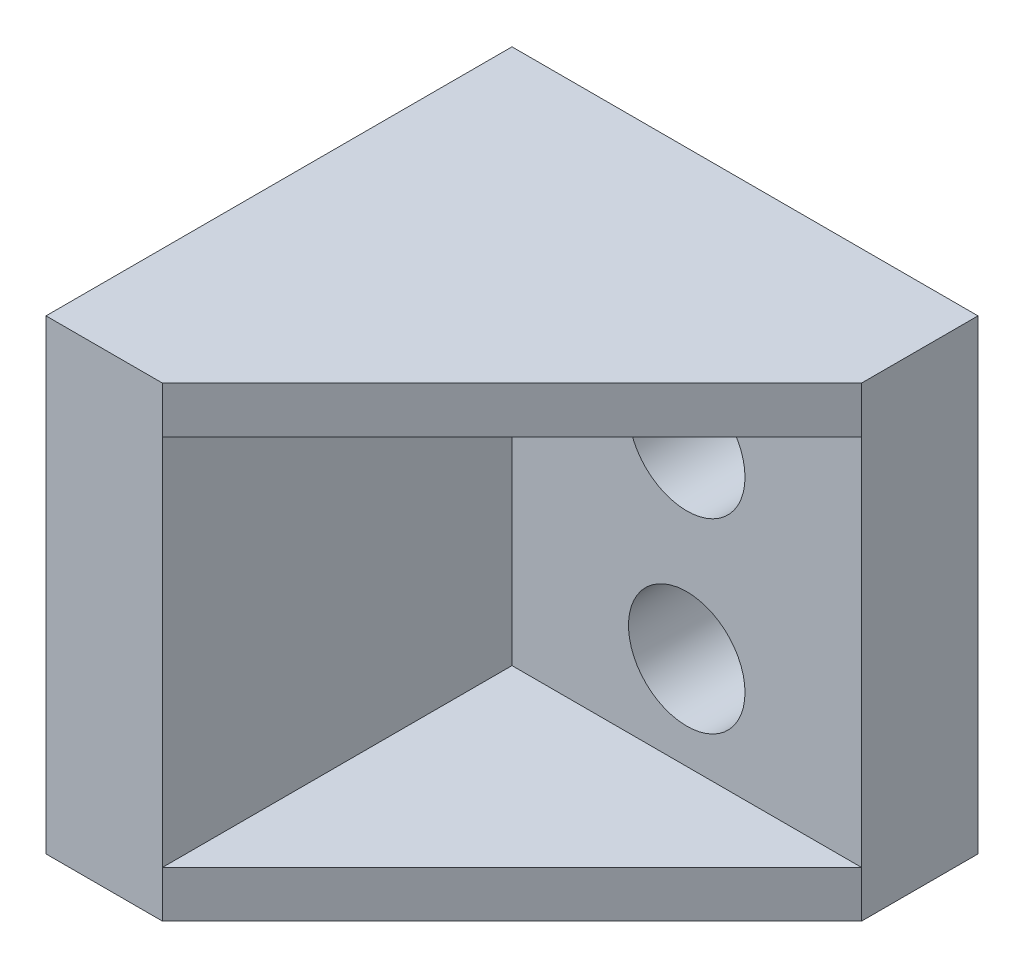
ISO-10303-21;
HEADER;
FILE_DESCRIPTION(('STEP AP214'),'2;1');
FILE_NAME('part.step','',(''),(''),'','','');
FILE_SCHEMA(('AUTOMOTIVE_DESIGN { 1 0 10303 214 1 1 1 1 }'));
ENDSEC;
DATA;
#1=APPLICATION_CONTEXT('core data for automotive mechanical design processes');
#2=APPLICATION_PROTOCOL_DEFINITION('international standard','automotive_design',2000,#1);
#3=PRODUCT_CONTEXT('',#1,'mechanical');
#4=PRODUCT('Part','Part','',(#3));
#5=PRODUCT_RELATED_PRODUCT_CATEGORY('part','',(#4));
#6=PRODUCT_DEFINITION_FORMATION('','',#4);
#7=PRODUCT_DEFINITION_CONTEXT('part definition',#1,'design');
#8=PRODUCT_DEFINITION('design','',#6,#7);
#9=PRODUCT_DEFINITION_SHAPE('','',#8);
#10=(LENGTH_UNIT() NAMED_UNIT(*) SI_UNIT(.MILLI.,.METRE.));
#11=(NAMED_UNIT(*) PLANE_ANGLE_UNIT() SI_UNIT($,.RADIAN.));
#12=(NAMED_UNIT(*) SI_UNIT($,.STERADIAN.) SOLID_ANGLE_UNIT());
#13=UNCERTAINTY_MEASURE_WITH_UNIT(LENGTH_MEASURE(1.E-05),#10,'distance_accuracy_value','');
#14=(GEOMETRIC_REPRESENTATION_CONTEXT(3) GLOBAL_UNCERTAINTY_ASSIGNED_CONTEXT((#13)) GLOBAL_UNIT_ASSIGNED_CONTEXT((#10,
#11,#12)) REPRESENTATION_CONTEXT('',''));
#15=CARTESIAN_POINT('',(0.,0.,0.));
#16=DIRECTION('',(0.,0.,1.));
#17=DIRECTION('',(1.,0.,0.));
#18=AXIS2_PLACEMENT_3D('',#15,#16,#17);
#19=CARTESIAN_POINT('',(-2.5,10.,0.));
#20=DIRECTION('',(1.,0.,0.));
#21=DIRECTION('',(0.,0.,-1.));
#22=AXIS2_PLACEMENT_3D('',#19,#20,#21);
#23=PLANE('',#22);
#24=DIRECTION('',(0.,0.,1.));
#25=VECTOR('',#24,1.);
#26=CARTESIAN_POINT('',(-2.5,1.,0.));
#27=LINE('',#26,#25);
#28=CARTESIAN_POINT('',(-2.5,0.999999999999999,0.));
#29=VERTEX_POINT('',#28);
#30=CARTESIAN_POINT('',(-2.5,1.,7.5));
#31=VERTEX_POINT('',#30);
#32=EDGE_CURVE('E51',#29,#31,#27,.T.);
#33=ORIENTED_EDGE('',*,*,#32,.F.);
#34=DIRECTION('',(0.,-1.,0.));
#35=VECTOR('',#34,1.);
#36=CARTESIAN_POINT('',(-2.5,10.,0.));
#37=LINE('',#36,#35);
#38=CARTESIAN_POINT('',(-2.5,9.,0.));
#39=VERTEX_POINT('',#38);
#40=EDGE_CURVE('E11',#39,#29,#37,.T.);
#41=ORIENTED_EDGE('',*,*,#40,.F.);
#42=DIRECTION('',(0.,0.,1.));
#43=VECTOR('',#42,1.);
#44=CARTESIAN_POINT('',(-2.5,9.,0.));
#45=LINE('',#44,#43);
#46=CARTESIAN_POINT('',(-2.5,9.,7.5));
#47=VERTEX_POINT('',#46);
#48=EDGE_CURVE('E136',#39,#47,#45,.T.);
#49=ORIENTED_EDGE('',*,*,#48,.T.);
#50=DIRECTION('',(0.,-1.,0.));
#51=VECTOR('',#50,1.);
#52=CARTESIAN_POINT('',(-2.5,10.,7.5));
#53=LINE('',#52,#51);
#54=EDGE_CURVE('E162',#47,#31,#53,.T.);
#55=ORIENTED_EDGE('',*,*,#54,.T.);
#56=EDGE_LOOP('',(#33,#41,#49,#55));
#57=FACE_BOUND('',#56,.T.);
#58=ADVANCED_FACE('F35',(#57),#23,.T.);
#59=CARTESIAN_POINT('',(0.,10.,0.));
#60=DIRECTION('',(0.,0.,-1.));
#61=DIRECTION('',(-1.,0.,0.));
#62=AXIS2_PLACEMENT_3D('',#59,#60,#61);
#63=PLANE('',#62);
#64=CARTESIAN_POINT('',(1.25,3.,0.));
#65=DIRECTION('',(0.,0.,-1.));
#66=DIRECTION('',(1.,0.,0.));
#67=AXIS2_PLACEMENT_3D('',#64,#65,#66);
#68=CIRCLE('',#67,1.25);
#69=CARTESIAN_POINT('',(2.5,3.,0.));
#70=VERTEX_POINT('',#69);
#71=EDGE_CURVE('E144',#70,#70,#68,.T.);
#72=ORIENTED_EDGE('',*,*,#71,.T.);
#73=EDGE_LOOP('',(#72));
#74=FACE_BOUND('',#73,.T.);
#75=CARTESIAN_POINT('',(1.25,7.,0.));
#76=DIRECTION('',(0.,0.,1.));
#77=DIRECTION('',(1.,0.,0.));
#78=AXIS2_PLACEMENT_3D('',#75,#76,#77);
#79=CIRCLE('',#78,1.25);
#80=CARTESIAN_POINT('',(2.5,7.,0.));
#81=VERTEX_POINT('',#80);
#82=EDGE_CURVE('E148',#81,#81,#79,.T.);
#83=ORIENTED_EDGE('',*,*,#82,.F.);
#84=EDGE_LOOP('',(#83));
#85=FACE_BOUND('',#84,.T.);
#86=ORIENTED_EDGE('',*,*,#40,.T.);
#87=DIRECTION('',(-1.,0.,0.));
#88=VECTOR('',#87,1.);
#89=CARTESIAN_POINT('',(5.,1.,0.));
#90=LINE('',#89,#88);
#91=CARTESIAN_POINT('',(5.,1.,0.));
#92=VERTEX_POINT('',#91);
#93=EDGE_CURVE('E57',#92,#29,#90,.T.);
#94=ORIENTED_EDGE('',*,*,#93,.F.);
#95=DIRECTION('',(0.,-1.,0.));
#96=VECTOR('',#95,1.);
#97=CARTESIAN_POINT('',(5.,10.,0.));
#98=LINE('',#97,#96);
#99=CARTESIAN_POINT('',(5.,9.,0.));
#100=VERTEX_POINT('',#99);
#101=EDGE_CURVE('E121',#100,#92,#98,.T.);
#102=ORIENTED_EDGE('',*,*,#101,.F.);
#103=DIRECTION('',(-1.,0.,0.));
#104=VECTOR('',#103,1.);
#105=CARTESIAN_POINT('',(5.,9.,0.));
#106=LINE('',#105,#104);
#107=EDGE_CURVE('E141',#100,#39,#106,.T.);
#108=ORIENTED_EDGE('',*,*,#107,.T.);
#109=EDGE_LOOP('',(#86,#94,#102,#108));
#110=FACE_BOUND('',#109,.T.);
#111=ADVANCED_FACE('F203',(#74,#85,#110),#63,.F.);
#112=CARTESIAN_POINT('',(5.,10.,0.));
#113=DIRECTION('',(1.,0.,0.));
#114=DIRECTION('',(0.,0.,-1.));
#115=AXIS2_PLACEMENT_3D('',#112,#113,#114);
#116=PLANE('',#115);
#117=DIRECTION('',(0.,0.,1.));
#118=VECTOR('',#117,1.);
#119=CARTESIAN_POINT('',(5.,0.,0.));
#120=LINE('',#119,#118);
#121=CARTESIAN_POINT('',(5.,0.,-2.5));
#122=VERTEX_POINT('',#121);
#123=CARTESIAN_POINT('',(5.,0.,0.));
#124=VERTEX_POINT('',#123);
#125=EDGE_CURVE('E104',#122,#124,#120,.T.);
#126=ORIENTED_EDGE('',*,*,#125,.F.);
#127=DIRECTION('',(0.,-1.,0.));
#128=VECTOR('',#127,1.);
#129=CARTESIAN_POINT('',(5.,10.,-2.5));
#130=LINE('',#129,#128);
#131=CARTESIAN_POINT('',(5.,10.,-2.5));
#132=VERTEX_POINT('',#131);
#133=EDGE_CURVE('E175',#132,#122,#130,.T.);
#134=ORIENTED_EDGE('',*,*,#133,.F.);
#135=DIRECTION('',(0.,0.,1.));
#136=VECTOR('',#135,1.);
#137=CARTESIAN_POINT('',(5.,10.,0.));
#138=LINE('',#137,#136);
#139=CARTESIAN_POINT('',(5.,10.,0.));
#140=VERTEX_POINT('',#139);
#141=EDGE_CURVE('E151',#132,#140,#138,.T.);
#142=ORIENTED_EDGE('',*,*,#141,.T.);
#143=EDGE_CURVE('E43',#140,#100,#98,.T.);
#144=ORIENTED_EDGE('',*,*,#143,.T.);
#145=ORIENTED_EDGE('',*,*,#101,.T.);
#146=DIRECTION('',(0.,-1.,0.));
#147=VECTOR('',#146,1.);
#148=CARTESIAN_POINT('',(5.,1.,0.));
#149=LINE('',#148,#147);
#150=EDGE_CURVE('E118',#92,#124,#149,.T.);
#151=ORIENTED_EDGE('',*,*,#150,.T.);
#152=EDGE_LOOP('',(#126,#134,#142,#144,#145,#151));
#153=FACE_BOUND('',#152,.T.);
#154=ADVANCED_FACE('F119',(#153),#116,.T.);
#155=CARTESIAN_POINT('',(0.,10.,-2.5));
#156=DIRECTION('',(0.,0.,-1.));
#157=DIRECTION('',(-1.,0.,0.));
#158=AXIS2_PLACEMENT_3D('',#155,#156,#157);
#159=PLANE('',#158);
#160=CARTESIAN_POINT('',(1.25,3.,-2.5));
#161=DIRECTION('',(0.,0.,-1.));
#162=DIRECTION('',(-1.,0.,0.));
#163=AXIS2_PLACEMENT_3D('',#160,#161,#162);
#164=CIRCLE('',#163,1.25);
#165=CARTESIAN_POINT('',(0.,3.,-2.5));
#166=VERTEX_POINT('',#165);
#167=EDGE_CURVE('E38',#166,#166,#164,.F.);
#168=ORIENTED_EDGE('',*,*,#167,.T.);
#169=EDGE_LOOP('',(#168));
#170=FACE_BOUND('',#169,.T.);
#171=CARTESIAN_POINT('',(1.25,7.,-2.5));
#172=DIRECTION('',(0.,0.,-1.));
#173=DIRECTION('',(-1.,0.,0.));
#174=AXIS2_PLACEMENT_3D('',#171,#172,#173);
#175=CIRCLE('',#174,1.25);
#176=CARTESIAN_POINT('',(0.,7.,-2.5));
#177=VERTEX_POINT('',#176);
#178=EDGE_CURVE('E115',#177,#177,#175,.T.);
#179=ORIENTED_EDGE('',*,*,#178,.F.);
#180=EDGE_LOOP('',(#179));
#181=FACE_BOUND('',#180,.T.);
#182=DIRECTION('',(1.,0.,0.));
#183=VECTOR('',#182,1.);
#184=CARTESIAN_POINT('',(0.,0.,-2.5));
#185=LINE('',#184,#183);
#186=CARTESIAN_POINT('',(-5.,0.,-2.5));
#187=VERTEX_POINT('',#186);
#188=EDGE_CURVE('E113',#187,#122,#185,.T.);
#189=ORIENTED_EDGE('',*,*,#188,.F.);
#190=DIRECTION('',(0.,-1.,0.));
#191=VECTOR('',#190,1.);
#192=CARTESIAN_POINT('',(-5.,10.,-2.5));
#193=LINE('',#192,#191);
#194=CARTESIAN_POINT('',(-5.,10.,-2.5));
#195=VERTEX_POINT('',#194);
#196=EDGE_CURVE('E173',#195,#187,#193,.T.);
#197=ORIENTED_EDGE('',*,*,#196,.F.);
#198=DIRECTION('',(1.,0.,0.));
#199=VECTOR('',#198,1.);
#200=CARTESIAN_POINT('',(0.,10.,-2.5));
#201=LINE('',#200,#199);
#202=EDGE_CURVE('E154',#195,#132,#201,.T.);
#203=ORIENTED_EDGE('',*,*,#202,.T.);
#204=ORIENTED_EDGE('',*,*,#133,.T.);
#205=EDGE_LOOP('',(#189,#197,#203,#204));
#206=FACE_BOUND('',#205,.T.);
#207=ADVANCED_FACE('F183',(#170,#181,#206),#159,.T.);
#208=CARTESIAN_POINT('',(-5.,10.,0.));
#209=DIRECTION('',(1.,0.,0.));
#210=DIRECTION('',(0.,0.,-1.));
#211=AXIS2_PLACEMENT_3D('',#208,#209,#210);
#212=PLANE('',#211);
#213=DIRECTION('',(0.,0.,1.));
#214=VECTOR('',#213,1.);
#215=CARTESIAN_POINT('',(-5.,0.,0.));
#216=LINE('',#215,#214);
#217=CARTESIAN_POINT('',(-5.,0.,7.5));
#218=VERTEX_POINT('',#217);
#219=EDGE_CURVE('E165',#187,#218,#216,.T.);
#220=ORIENTED_EDGE('',*,*,#219,.T.);
#221=DIRECTION('',(0.,-1.,0.));
#222=VECTOR('',#221,1.);
#223=CARTESIAN_POINT('',(-5.,10.,7.5));
#224=LINE('',#223,#222);
#225=CARTESIAN_POINT('',(-5.,10.,7.5));
#226=VERTEX_POINT('',#225);
#227=EDGE_CURVE('E170',#226,#218,#224,.T.);
#228=ORIENTED_EDGE('',*,*,#227,.F.);
#229=DIRECTION('',(0.,0.,1.));
#230=VECTOR('',#229,1.);
#231=CARTESIAN_POINT('',(-5.,10.,0.));
#232=LINE('',#231,#230);
#233=EDGE_CURVE('E158',#195,#226,#232,.T.);
#234=ORIENTED_EDGE('',*,*,#233,.F.);
#235=ORIENTED_EDGE('',*,*,#196,.T.);
#236=EDGE_LOOP('',(#220,#228,#234,#235));
#237=FACE_BOUND('',#236,.T.);
#238=ADVANCED_FACE('F186',(#237),#212,.F.);
#239=CARTESIAN_POINT('',(0.,10.,7.5));
#240=DIRECTION('',(0.,0.,-1.));
#241=DIRECTION('',(-1.,0.,0.));
#242=AXIS2_PLACEMENT_3D('',#239,#240,#241);
#243=PLANE('',#242);
#244=DIRECTION('',(1.,0.,0.));
#245=VECTOR('',#244,1.);
#246=CARTESIAN_POINT('',(0.,0.,7.5));
#247=LINE('',#246,#245);
#248=CARTESIAN_POINT('',(-2.5,0.,7.5));
#249=VERTEX_POINT('',#248);
#250=EDGE_CURVE('E155',#218,#249,#247,.T.);
#251=ORIENTED_EDGE('',*,*,#250,.T.);
#252=DIRECTION('',(0.,-1.,0.));
#253=VECTOR('',#252,1.);
#254=CARTESIAN_POINT('',(-2.5,1.,7.5));
#255=LINE('',#254,#253);
#256=EDGE_CURVE('E125',#31,#249,#255,.T.);
#257=ORIENTED_EDGE('',*,*,#256,.F.);
#258=ORIENTED_EDGE('',*,*,#54,.F.);
#259=CARTESIAN_POINT('',(-2.5,10.,7.5));
#260=VERTEX_POINT('',#259);
#261=EDGE_CURVE('E168',#260,#47,#53,.T.);
#262=ORIENTED_EDGE('',*,*,#261,.F.);
#263=DIRECTION('',(1.,0.,0.));
#264=VECTOR('',#263,1.);
#265=CARTESIAN_POINT('',(0.,10.,7.5));
#266=LINE('',#265,#264);
#267=EDGE_CURVE('E160',#226,#260,#266,.T.);
#268=ORIENTED_EDGE('',*,*,#267,.F.);
#269=ORIENTED_EDGE('',*,*,#227,.T.);
#270=EDGE_LOOP('',(#251,#257,#258,#262,#268,#269));
#271=FACE_BOUND('',#270,.T.);
#272=ADVANCED_FACE('F215',(#271),#243,.F.);
#273=CARTESIAN_POINT('',(0.,10.,0.));
#274=DIRECTION('',(0.,1.,0.));
#275=DIRECTION('',(0.,0.,1.));
#276=AXIS2_PLACEMENT_3D('',#273,#274,#275);
#277=PLANE('',#276);
#278=ORIENTED_EDGE('',*,*,#267,.T.);
#279=DIRECTION('',(0.707106781186547,0.,-0.707106781186547));
#280=VECTOR('',#279,1.);
#281=CARTESIAN_POINT('',(-2.5,10.,7.5));
#282=LINE('',#281,#280);
#283=EDGE_CURVE('E134',#260,#140,#282,.T.);
#284=ORIENTED_EDGE('',*,*,#283,.T.);
#285=ORIENTED_EDGE('',*,*,#141,.F.);
#286=ORIENTED_EDGE('',*,*,#202,.F.);
#287=ORIENTED_EDGE('',*,*,#233,.T.);
#288=EDGE_LOOP('',(#278,#284,#285,#286,#287));
#289=FACE_BOUND('',#288,.T.);
#290=ADVANCED_FACE('F193',(#289),#277,.T.);
#291=CARTESIAN_POINT('',(0.,0.,0.));
#292=DIRECTION('',(0.,1.,0.));
#293=DIRECTION('',(0.,0.,1.));
#294=AXIS2_PLACEMENT_3D('',#291,#292,#293);
#295=PLANE('',#294);
#296=DIRECTION('',(0.707106781186547,0.,-0.707106781186547));
#297=VECTOR('',#296,1.);
#298=CARTESIAN_POINT('',(-2.5,0.,7.5));
#299=LINE('',#298,#297);
#300=EDGE_CURVE('E109',#249,#124,#299,.T.);
#301=ORIENTED_EDGE('',*,*,#300,.F.);
#302=ORIENTED_EDGE('',*,*,#250,.F.);
#303=ORIENTED_EDGE('',*,*,#219,.F.);
#304=ORIENTED_EDGE('',*,*,#188,.T.);
#305=ORIENTED_EDGE('',*,*,#125,.T.);
#306=EDGE_LOOP('',(#301,#302,#303,#304,#305));
#307=FACE_BOUND('',#306,.T.);
#308=ADVANCED_FACE('F106',(#307),#295,.F.);
#309=CARTESIAN_POINT('',(1.25,7.,-10.));
#310=DIRECTION('',(0.,0.,1.));
#311=DIRECTION('',(1.,0.,0.));
#312=AXIS2_PLACEMENT_3D('',#309,#310,#311);
#313=CYLINDRICAL_SURFACE('',#312,1.25);
#314=ORIENTED_EDGE('',*,*,#178,.T.);
#315=EDGE_LOOP('',(#314));
#316=FACE_BOUND('',#315,.T.);
#317=ORIENTED_EDGE('',*,*,#82,.T.);
#318=EDGE_LOOP('',(#317));
#319=FACE_BOUND('',#318,.T.);
#320=ADVANCED_FACE('F180',(#316,#319),#313,.F.);
#321=CARTESIAN_POINT('',(1.25,3.,-10.));
#322=DIRECTION('',(0.,0.,1.));
#323=DIRECTION('',(1.,0.,0.));
#324=AXIS2_PLACEMENT_3D('',#321,#322,#323);
#325=CYLINDRICAL_SURFACE('',#324,1.25);
#326=ORIENTED_EDGE('',*,*,#167,.F.);
#327=EDGE_LOOP('',(#326));
#328=FACE_BOUND('',#327,.T.);
#329=ORIENTED_EDGE('',*,*,#71,.F.);
#330=EDGE_LOOP('',(#329));
#331=FACE_BOUND('',#330,.T.);
#332=ADVANCED_FACE('F226',(#328,#331),#325,.F.);
#333=CARTESIAN_POINT('',(-2.5,9.,7.5));
#334=DIRECTION('',(0.707106781186547,0.,0.707106781186547));
#335=DIRECTION('',(0.707106781186548,0.,-0.707106781186548));
#336=AXIS2_PLACEMENT_3D('',#333,#334,#335);
#337=PLANE('',#336);
#338=ORIENTED_EDGE('',*,*,#283,.F.);
#339=ORIENTED_EDGE('',*,*,#261,.T.);
#340=DIRECTION('',(0.707106781186547,0.,-0.707106781186547));
#341=VECTOR('',#340,1.);
#342=CARTESIAN_POINT('',(-2.5,9.,7.5));
#343=LINE('',#342,#341);
#344=EDGE_CURVE('E139',#47,#100,#343,.T.);
#345=ORIENTED_EDGE('',*,*,#344,.T.);
#346=ORIENTED_EDGE('',*,*,#143,.F.);
#347=EDGE_LOOP('',(#338,#339,#345,#346));
#348=FACE_BOUND('',#347,.T.);
#349=ADVANCED_FACE('F198',(#348),#337,.T.);
#350=CARTESIAN_POINT('',(0.,9.,0.));
#351=DIRECTION('',(0.,-1.,0.));
#352=DIRECTION('',(0.,0.,-1.));
#353=AXIS2_PLACEMENT_3D('',#350,#351,#352);
#354=PLANE('',#353);
#355=ORIENTED_EDGE('',*,*,#48,.F.);
#356=ORIENTED_EDGE('',*,*,#107,.F.);
#357=ORIENTED_EDGE('',*,*,#344,.F.);
#358=EDGE_LOOP('',(#355,#356,#357));
#359=FACE_BOUND('',#358,.T.);
#360=ADVANCED_FACE('F202',(#359),#354,.T.);
#361=CARTESIAN_POINT('',(-2.5,1.,7.5));
#362=DIRECTION('',(-0.707106781186547,0.,-0.707106781186547));
#363=DIRECTION('',(-0.707106781186548,0.,0.707106781186548));
#364=AXIS2_PLACEMENT_3D('',#361,#362,#363);
#365=PLANE('',#364);
#366=ORIENTED_EDGE('',*,*,#300,.T.);
#367=ORIENTED_EDGE('',*,*,#150,.F.);
#368=DIRECTION('',(0.707106781186547,0.,-0.707106781186547));
#369=VECTOR('',#368,1.);
#370=CARTESIAN_POINT('',(-2.5,1.,7.5));
#371=LINE('',#370,#369);
#372=EDGE_CURVE('E126',#31,#92,#371,.T.);
#373=ORIENTED_EDGE('',*,*,#372,.F.);
#374=ORIENTED_EDGE('',*,*,#256,.T.);
#375=EDGE_LOOP('',(#366,#367,#373,#374));
#376=FACE_BOUND('',#375,.T.);
#377=ADVANCED_FACE('F128',(#376),#365,.F.);
#378=CARTESIAN_POINT('',(0.,1.,0.));
#379=DIRECTION('',(0.,1.,0.));
#380=DIRECTION('',(0.,0.,-1.));
#381=AXIS2_PLACEMENT_3D('',#378,#379,#380);
#382=PLANE('',#381);
#383=ORIENTED_EDGE('',*,*,#32,.T.);
#384=ORIENTED_EDGE('',*,*,#372,.T.);
#385=ORIENTED_EDGE('',*,*,#93,.T.);
#386=EDGE_LOOP('',(#383,#384,#385));
#387=FACE_BOUND('',#386,.T.);
#388=ADVANCED_FACE('F236',(#387),#382,.T.);
#389=CLOSED_SHELL('',(#58,#111,#154,#207,#238,#272,#290,#308,#320,#332,#349,#360,#377,#388));
#390=MANIFOLD_SOLID_BREP('B2',#389);
#391=ADVANCED_BREP_SHAPE_REPRESENTATION('',(#18,#390),#14);
#392=SHAPE_DEFINITION_REPRESENTATION(#9,#391);
ENDSEC;
END-ISO-10303-21;
